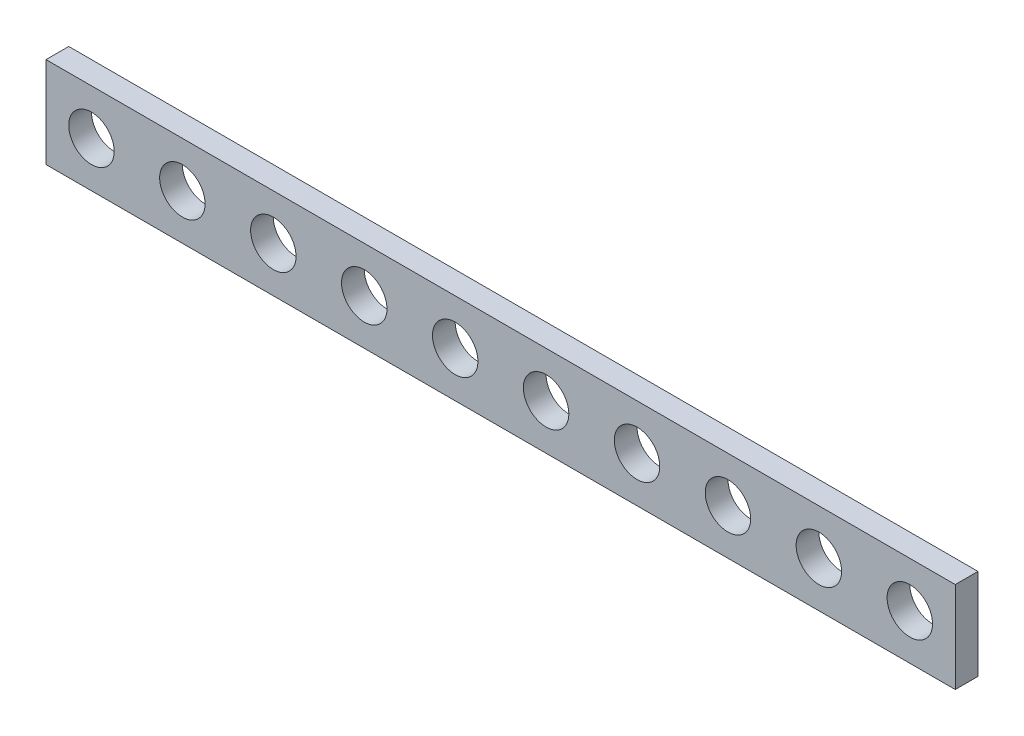
ISO-10303-21;
HEADER;
FILE_DESCRIPTION(('STEP AP214'),'2;1');
FILE_NAME('part.step','',(''),(''),'','','');
FILE_SCHEMA(('AUTOMOTIVE_DESIGN { 1 0 10303 214 1 1 1 1 }'));
ENDSEC;
DATA;
#1=APPLICATION_CONTEXT('core data for automotive mechanical design processes');
#2=APPLICATION_PROTOCOL_DEFINITION('international standard','automotive_design',2000,#1);
#3=PRODUCT_CONTEXT('',#1,'mechanical');
#4=PRODUCT('Part','Part','',(#3));
#5=PRODUCT_RELATED_PRODUCT_CATEGORY('part','',(#4));
#6=PRODUCT_DEFINITION_FORMATION('','',#4);
#7=PRODUCT_DEFINITION_CONTEXT('part definition',#1,'design');
#8=PRODUCT_DEFINITION('design','',#6,#7);
#9=PRODUCT_DEFINITION_SHAPE('','',#8);
#10=(LENGTH_UNIT() NAMED_UNIT(*) SI_UNIT(.MILLI.,.METRE.));
#11=(NAMED_UNIT(*) PLANE_ANGLE_UNIT() SI_UNIT($,.RADIAN.));
#12=(NAMED_UNIT(*) SI_UNIT($,.STERADIAN.) SOLID_ANGLE_UNIT());
#13=UNCERTAINTY_MEASURE_WITH_UNIT(LENGTH_MEASURE(1.E-05),#10,'distance_accuracy_value','');
#14=(GEOMETRIC_REPRESENTATION_CONTEXT(3) GLOBAL_UNCERTAINTY_ASSIGNED_CONTEXT((#13)) GLOBAL_UNIT_ASSIGNED_CONTEXT((#10,
#11,#12)) REPRESENTATION_CONTEXT('',''));
#15=CARTESIAN_POINT('',(0.,0.,0.));
#16=DIRECTION('',(0.,0.,1.));
#17=DIRECTION('',(1.,0.,0.));
#18=AXIS2_PLACEMENT_3D('',#15,#16,#17);
#19=CARTESIAN_POINT('',(190.,10.,5.));
#20=DIRECTION('',(0.,0.,-1.));
#21=DIRECTION('',(-1.,0.,0.));
#22=AXIS2_PLACEMENT_3D('',#19,#20,#21);
#23=CYLINDRICAL_SURFACE('',#22,5.);
#24=CARTESIAN_POINT('',(190.,10.,5.));
#25=DIRECTION('',(0.,0.,1.));
#26=DIRECTION('',(1.,0.,0.));
#27=AXIS2_PLACEMENT_3D('',#24,#25,#26);
#28=CIRCLE('',#27,5.);
#29=CARTESIAN_POINT('',(195.,10.,5.));
#30=VERTEX_POINT('',#29);
#31=EDGE_CURVE('E43',#30,#30,#28,.T.);
#32=ORIENTED_EDGE('',*,*,#31,.T.);
#33=EDGE_LOOP('',(#32));
#34=FACE_BOUND('',#33,.T.);
#35=CARTESIAN_POINT('',(190.,10.,0.));
#36=DIRECTION('',(0.,0.,1.));
#37=DIRECTION('',(1.,0.,0.));
#38=AXIS2_PLACEMENT_3D('',#35,#36,#37);
#39=CIRCLE('',#38,5.);
#40=CARTESIAN_POINT('',(195.,10.,0.));
#41=VERTEX_POINT('',#40);
#42=EDGE_CURVE('E11',#41,#41,#39,.T.);
#43=ORIENTED_EDGE('',*,*,#42,.F.);
#44=EDGE_LOOP('',(#43));
#45=FACE_BOUND('',#44,.T.);
#46=ADVANCED_FACE('F35',(#34,#45),#23,.F.);
#47=CARTESIAN_POINT('',(170.,10.,5.));
#48=DIRECTION('',(0.,0.,-1.));
#49=DIRECTION('',(-1.,0.,0.));
#50=AXIS2_PLACEMENT_3D('',#47,#48,#49);
#51=CYLINDRICAL_SURFACE('',#50,5.);
#52=CARTESIAN_POINT('',(170.,10.,5.));
#53=DIRECTION('',(0.,0.,1.));
#54=DIRECTION('',(1.,0.,0.));
#55=AXIS2_PLACEMENT_3D('',#52,#53,#54);
#56=CIRCLE('',#55,5.);
#57=CARTESIAN_POINT('',(175.,10.,5.));
#58=VERTEX_POINT('',#57);
#59=EDGE_CURVE('E155',#58,#58,#56,.T.);
#60=ORIENTED_EDGE('',*,*,#59,.T.);
#61=EDGE_LOOP('',(#60));
#62=FACE_BOUND('',#61,.T.);
#63=CARTESIAN_POINT('',(170.,10.,0.));
#64=DIRECTION('',(0.,0.,1.));
#65=DIRECTION('',(1.,0.,0.));
#66=AXIS2_PLACEMENT_3D('',#63,#64,#65);
#67=CIRCLE('',#66,5.);
#68=CARTESIAN_POINT('',(175.,10.,0.));
#69=VERTEX_POINT('',#68);
#70=EDGE_CURVE('E158',#69,#69,#67,.T.);
#71=ORIENTED_EDGE('',*,*,#70,.F.);
#72=EDGE_LOOP('',(#71));
#73=FACE_BOUND('',#72,.T.);
#74=ADVANCED_FACE('F217',(#62,#73),#51,.F.);
#75=CARTESIAN_POINT('',(150.,10.,5.));
#76=DIRECTION('',(0.,0.,-1.));
#77=DIRECTION('',(-1.,0.,0.));
#78=AXIS2_PLACEMENT_3D('',#75,#76,#77);
#79=CYLINDRICAL_SURFACE('',#78,5.);
#80=CARTESIAN_POINT('',(150.,10.,5.));
#81=DIRECTION('',(0.,0.,1.));
#82=DIRECTION('',(1.,0.,0.));
#83=AXIS2_PLACEMENT_3D('',#80,#81,#82);
#84=CIRCLE('',#83,5.);
#85=CARTESIAN_POINT('',(155.,10.,5.));
#86=VERTEX_POINT('',#85);
#87=EDGE_CURVE('E149',#86,#86,#84,.T.);
#88=ORIENTED_EDGE('',*,*,#87,.T.);
#89=EDGE_LOOP('',(#88));
#90=FACE_BOUND('',#89,.T.);
#91=CARTESIAN_POINT('',(150.,10.,0.));
#92=DIRECTION('',(0.,0.,1.));
#93=DIRECTION('',(1.,0.,0.));
#94=AXIS2_PLACEMENT_3D('',#91,#92,#93);
#95=CIRCLE('',#94,5.);
#96=CARTESIAN_POINT('',(155.,10.,0.));
#97=VERTEX_POINT('',#96);
#98=EDGE_CURVE('E152',#97,#97,#95,.T.);
#99=ORIENTED_EDGE('',*,*,#98,.F.);
#100=EDGE_LOOP('',(#99));
#101=FACE_BOUND('',#100,.T.);
#102=ADVANCED_FACE('F221',(#90,#101),#79,.F.);
#103=CARTESIAN_POINT('',(130.,10.,5.));
#104=DIRECTION('',(0.,0.,-1.));
#105=DIRECTION('',(-1.,0.,0.));
#106=AXIS2_PLACEMENT_3D('',#103,#104,#105);
#107=CYLINDRICAL_SURFACE('',#106,5.);
#108=CARTESIAN_POINT('',(130.,10.,5.));
#109=DIRECTION('',(0.,0.,1.));
#110=DIRECTION('',(1.,0.,0.));
#111=AXIS2_PLACEMENT_3D('',#108,#109,#110);
#112=CIRCLE('',#111,5.);
#113=CARTESIAN_POINT('',(135.,10.,5.));
#114=VERTEX_POINT('',#113);
#115=EDGE_CURVE('E143',#114,#114,#112,.T.);
#116=ORIENTED_EDGE('',*,*,#115,.T.);
#117=EDGE_LOOP('',(#116));
#118=FACE_BOUND('',#117,.T.);
#119=CARTESIAN_POINT('',(130.,10.,0.));
#120=DIRECTION('',(0.,0.,1.));
#121=DIRECTION('',(1.,0.,0.));
#122=AXIS2_PLACEMENT_3D('',#119,#120,#121);
#123=CIRCLE('',#122,5.);
#124=CARTESIAN_POINT('',(135.,10.,0.));
#125=VERTEX_POINT('',#124);
#126=EDGE_CURVE('E146',#125,#125,#123,.T.);
#127=ORIENTED_EDGE('',*,*,#126,.F.);
#128=EDGE_LOOP('',(#127));
#129=FACE_BOUND('',#128,.T.);
#130=ADVANCED_FACE('F226',(#118,#129),#107,.F.);
#131=CARTESIAN_POINT('',(110.,10.,5.));
#132=DIRECTION('',(0.,0.,-1.));
#133=DIRECTION('',(-1.,0.,0.));
#134=AXIS2_PLACEMENT_3D('',#131,#132,#133);
#135=CYLINDRICAL_SURFACE('',#134,5.);
#136=CARTESIAN_POINT('',(110.,10.,5.));
#137=DIRECTION('',(0.,0.,1.));
#138=DIRECTION('',(1.,0.,0.));
#139=AXIS2_PLACEMENT_3D('',#136,#137,#138);
#140=CIRCLE('',#139,5.);
#141=CARTESIAN_POINT('',(115.,10.,5.));
#142=VERTEX_POINT('',#141);
#143=EDGE_CURVE('E137',#142,#142,#140,.T.);
#144=ORIENTED_EDGE('',*,*,#143,.T.);
#145=EDGE_LOOP('',(#144));
#146=FACE_BOUND('',#145,.T.);
#147=CARTESIAN_POINT('',(110.,10.,0.));
#148=DIRECTION('',(0.,0.,1.));
#149=DIRECTION('',(1.,0.,0.));
#150=AXIS2_PLACEMENT_3D('',#147,#148,#149);
#151=CIRCLE('',#150,5.);
#152=CARTESIAN_POINT('',(115.,10.,0.));
#153=VERTEX_POINT('',#152);
#154=EDGE_CURVE('E140',#153,#153,#151,.T.);
#155=ORIENTED_EDGE('',*,*,#154,.F.);
#156=EDGE_LOOP('',(#155));
#157=FACE_BOUND('',#156,.T.);
#158=ADVANCED_FACE('F233',(#146,#157),#135,.F.);
#159=CARTESIAN_POINT('',(90.,10.,5.));
#160=DIRECTION('',(0.,0.,-1.));
#161=DIRECTION('',(-1.,0.,0.));
#162=AXIS2_PLACEMENT_3D('',#159,#160,#161);
#163=CYLINDRICAL_SURFACE('',#162,5.);
#164=CARTESIAN_POINT('',(90.,10.,5.));
#165=DIRECTION('',(0.,0.,1.));
#166=DIRECTION('',(1.,0.,0.));
#167=AXIS2_PLACEMENT_3D('',#164,#165,#166);
#168=CIRCLE('',#167,5.);
#169=CARTESIAN_POINT('',(95.,10.,5.));
#170=VERTEX_POINT('',#169);
#171=EDGE_CURVE('E131',#170,#170,#168,.T.);
#172=ORIENTED_EDGE('',*,*,#171,.T.);
#173=EDGE_LOOP('',(#172));
#174=FACE_BOUND('',#173,.T.);
#175=CARTESIAN_POINT('',(90.,10.,0.));
#176=DIRECTION('',(0.,0.,1.));
#177=DIRECTION('',(1.,0.,0.));
#178=AXIS2_PLACEMENT_3D('',#175,#176,#177);
#179=CIRCLE('',#178,5.);
#180=CARTESIAN_POINT('',(95.,10.,0.));
#181=VERTEX_POINT('',#180);
#182=EDGE_CURVE('E134',#181,#181,#179,.T.);
#183=ORIENTED_EDGE('',*,*,#182,.F.);
#184=EDGE_LOOP('',(#183));
#185=FACE_BOUND('',#184,.T.);
#186=ADVANCED_FACE('F237',(#174,#185),#163,.F.);
#187=CARTESIAN_POINT('',(70.,10.,5.));
#188=DIRECTION('',(0.,0.,-1.));
#189=DIRECTION('',(-1.,0.,0.));
#190=AXIS2_PLACEMENT_3D('',#187,#188,#189);
#191=CYLINDRICAL_SURFACE('',#190,5.);
#192=CARTESIAN_POINT('',(70.,10.,5.));
#193=DIRECTION('',(0.,0.,1.));
#194=DIRECTION('',(1.,0.,0.));
#195=AXIS2_PLACEMENT_3D('',#192,#193,#194);
#196=CIRCLE('',#195,5.);
#197=CARTESIAN_POINT('',(75.,10.,5.));
#198=VERTEX_POINT('',#197);
#199=EDGE_CURVE('E125',#198,#198,#196,.T.);
#200=ORIENTED_EDGE('',*,*,#199,.T.);
#201=EDGE_LOOP('',(#200));
#202=FACE_BOUND('',#201,.T.);
#203=CARTESIAN_POINT('',(70.,10.,0.));
#204=DIRECTION('',(0.,0.,1.));
#205=DIRECTION('',(1.,0.,0.));
#206=AXIS2_PLACEMENT_3D('',#203,#204,#205);
#207=CIRCLE('',#206,5.);
#208=CARTESIAN_POINT('',(75.,10.,0.));
#209=VERTEX_POINT('',#208);
#210=EDGE_CURVE('E128',#209,#209,#207,.T.);
#211=ORIENTED_EDGE('',*,*,#210,.F.);
#212=EDGE_LOOP('',(#211));
#213=FACE_BOUND('',#212,.T.);
#214=ADVANCED_FACE('F241',(#202,#213),#191,.F.);
#215=CARTESIAN_POINT('',(50.,10.,5.));
#216=DIRECTION('',(0.,0.,-1.));
#217=DIRECTION('',(-1.,0.,0.));
#218=AXIS2_PLACEMENT_3D('',#215,#216,#217);
#219=CYLINDRICAL_SURFACE('',#218,5.);
#220=CARTESIAN_POINT('',(50.,10.,5.));
#221=DIRECTION('',(0.,0.,1.));
#222=DIRECTION('',(1.,0.,0.));
#223=AXIS2_PLACEMENT_3D('',#220,#221,#222);
#224=CIRCLE('',#223,5.);
#225=CARTESIAN_POINT('',(55.,10.,5.));
#226=VERTEX_POINT('',#225);
#227=EDGE_CURVE('E119',#226,#226,#224,.T.);
#228=ORIENTED_EDGE('',*,*,#227,.T.);
#229=EDGE_LOOP('',(#228));
#230=FACE_BOUND('',#229,.T.);
#231=CARTESIAN_POINT('',(50.,10.,0.));
#232=DIRECTION('',(0.,0.,1.));
#233=DIRECTION('',(1.,0.,0.));
#234=AXIS2_PLACEMENT_3D('',#231,#232,#233);
#235=CIRCLE('',#234,5.);
#236=CARTESIAN_POINT('',(55.,10.,0.));
#237=VERTEX_POINT('',#236);
#238=EDGE_CURVE('E122',#237,#237,#235,.T.);
#239=ORIENTED_EDGE('',*,*,#238,.F.);
#240=EDGE_LOOP('',(#239));
#241=FACE_BOUND('',#240,.T.);
#242=ADVANCED_FACE('F188',(#230,#241),#219,.F.);
#243=CARTESIAN_POINT('',(30.,10.,5.));
#244=DIRECTION('',(0.,0.,-1.));
#245=DIRECTION('',(-1.,0.,0.));
#246=AXIS2_PLACEMENT_3D('',#243,#244,#245);
#247=CYLINDRICAL_SURFACE('',#246,5.);
#248=CARTESIAN_POINT('',(30.,10.,5.));
#249=DIRECTION('',(0.,0.,1.));
#250=DIRECTION('',(1.,0.,0.));
#251=AXIS2_PLACEMENT_3D('',#248,#249,#250);
#252=CIRCLE('',#251,5.);
#253=CARTESIAN_POINT('',(35.,10.,5.));
#254=VERTEX_POINT('',#253);
#255=EDGE_CURVE('E113',#254,#254,#252,.T.);
#256=ORIENTED_EDGE('',*,*,#255,.T.);
#257=EDGE_LOOP('',(#256));
#258=FACE_BOUND('',#257,.T.);
#259=CARTESIAN_POINT('',(30.,10.,0.));
#260=DIRECTION('',(0.,0.,1.));
#261=DIRECTION('',(1.,0.,0.));
#262=AXIS2_PLACEMENT_3D('',#259,#260,#261);
#263=CIRCLE('',#262,5.);
#264=CARTESIAN_POINT('',(35.,10.,0.));
#265=VERTEX_POINT('',#264);
#266=EDGE_CURVE('E116',#265,#265,#263,.T.);
#267=ORIENTED_EDGE('',*,*,#266,.F.);
#268=EDGE_LOOP('',(#267));
#269=FACE_BOUND('',#268,.T.);
#270=ADVANCED_FACE('F168',(#258,#269),#247,.F.);
#271=CARTESIAN_POINT('',(0.,0.,5.));
#272=DIRECTION('',(0.,0.,-1.));
#273=DIRECTION('',(-1.,0.,0.));
#274=AXIS2_PLACEMENT_3D('',#271,#272,#273);
#275=PLANE('',#274);
#276=ORIENTED_EDGE('',*,*,#31,.F.);
#277=EDGE_LOOP('',(#276));
#278=FACE_BOUND('',#277,.T.);
#279=ORIENTED_EDGE('',*,*,#59,.F.);
#280=EDGE_LOOP('',(#279));
#281=FACE_BOUND('',#280,.T.);
#282=ORIENTED_EDGE('',*,*,#87,.F.);
#283=EDGE_LOOP('',(#282));
#284=FACE_BOUND('',#283,.T.);
#285=ORIENTED_EDGE('',*,*,#115,.F.);
#286=EDGE_LOOP('',(#285));
#287=FACE_BOUND('',#286,.T.);
#288=ORIENTED_EDGE('',*,*,#143,.F.);
#289=EDGE_LOOP('',(#288));
#290=FACE_BOUND('',#289,.T.);
#291=ORIENTED_EDGE('',*,*,#171,.F.);
#292=EDGE_LOOP('',(#291));
#293=FACE_BOUND('',#292,.T.);
#294=ORIENTED_EDGE('',*,*,#199,.F.);
#295=EDGE_LOOP('',(#294));
#296=FACE_BOUND('',#295,.T.);
#297=ORIENTED_EDGE('',*,*,#227,.F.);
#298=EDGE_LOOP('',(#297));
#299=FACE_BOUND('',#298,.T.);
#300=ORIENTED_EDGE('',*,*,#255,.F.);
#301=EDGE_LOOP('',(#300));
#302=FACE_BOUND('',#301,.T.);
#303=DIRECTION('',(0.,-1.,0.));
#304=VECTOR('',#303,1.);
#305=CARTESIAN_POINT('',(0.,0.,5.));
#306=LINE('',#305,#304);
#307=CARTESIAN_POINT('',(0.,20.,5.));
#308=VERTEX_POINT('',#307);
#309=CARTESIAN_POINT('',(0.,0.,5.));
#310=VERTEX_POINT('',#309);
#311=EDGE_CURVE('E88',#308,#310,#306,.T.);
#312=ORIENTED_EDGE('',*,*,#311,.T.);
#313=DIRECTION('',(1.,0.,0.));
#314=VECTOR('',#313,1.);
#315=CARTESIAN_POINT('',(0.,0.,5.));
#316=LINE('',#315,#314);
#317=CARTESIAN_POINT('',(200.,0.,5.));
#318=VERTEX_POINT('',#317);
#319=EDGE_CURVE('E82',#310,#318,#316,.T.);
#320=ORIENTED_EDGE('',*,*,#319,.T.);
#321=DIRECTION('',(0.,1.,0.));
#322=VECTOR('',#321,1.);
#323=CARTESIAN_POINT('',(200.,20.,5.));
#324=LINE('',#323,#322);
#325=CARTESIAN_POINT('',(200.,20.,5.));
#326=VERTEX_POINT('',#325);
#327=EDGE_CURVE('E86',#318,#326,#324,.T.);
#328=ORIENTED_EDGE('',*,*,#327,.T.);
#329=DIRECTION('',(-1.,0.,0.));
#330=VECTOR('',#329,1.);
#331=CARTESIAN_POINT('',(0.,20.,5.));
#332=LINE('',#331,#330);
#333=EDGE_CURVE('E51',#326,#308,#332,.T.);
#334=ORIENTED_EDGE('',*,*,#333,.T.);
#335=EDGE_LOOP('',(#312,#320,#328,#334));
#336=FACE_BOUND('',#335,.T.);
#337=CARTESIAN_POINT('',(10.,10.,5.));
#338=DIRECTION('',(0.,0.,1.));
#339=DIRECTION('',(1.,0.,0.));
#340=AXIS2_PLACEMENT_3D('',#337,#338,#339);
#341=CIRCLE('',#340,5.);
#342=CARTESIAN_POINT('',(15.,10.,5.));
#343=VERTEX_POINT('',#342);
#344=EDGE_CURVE('E106',#343,#343,#341,.T.);
#345=ORIENTED_EDGE('',*,*,#344,.F.);
#346=EDGE_LOOP('',(#345));
#347=FACE_BOUND('',#346,.T.);
#348=ADVANCED_FACE('F83',(#278,#281,#284,#287,#290,#293,#296,#299,#302,#336,#347),#275,.F.);
#349=CARTESIAN_POINT('',(0.,0.,0.));
#350=DIRECTION('',(0.,0.,-1.));
#351=DIRECTION('',(-1.,0.,0.));
#352=AXIS2_PLACEMENT_3D('',#349,#350,#351);
#353=PLANE('',#352);
#354=ORIENTED_EDGE('',*,*,#42,.T.);
#355=EDGE_LOOP('',(#354));
#356=FACE_BOUND('',#355,.T.);
#357=ORIENTED_EDGE('',*,*,#70,.T.);
#358=EDGE_LOOP('',(#357));
#359=FACE_BOUND('',#358,.T.);
#360=ORIENTED_EDGE('',*,*,#98,.T.);
#361=EDGE_LOOP('',(#360));
#362=FACE_BOUND('',#361,.T.);
#363=ORIENTED_EDGE('',*,*,#126,.T.);
#364=EDGE_LOOP('',(#363));
#365=FACE_BOUND('',#364,.T.);
#366=ORIENTED_EDGE('',*,*,#154,.T.);
#367=EDGE_LOOP('',(#366));
#368=FACE_BOUND('',#367,.T.);
#369=ORIENTED_EDGE('',*,*,#182,.T.);
#370=EDGE_LOOP('',(#369));
#371=FACE_BOUND('',#370,.T.);
#372=ORIENTED_EDGE('',*,*,#210,.T.);
#373=EDGE_LOOP('',(#372));
#374=FACE_BOUND('',#373,.T.);
#375=ORIENTED_EDGE('',*,*,#238,.T.);
#376=EDGE_LOOP('',(#375));
#377=FACE_BOUND('',#376,.T.);
#378=ORIENTED_EDGE('',*,*,#266,.T.);
#379=EDGE_LOOP('',(#378));
#380=FACE_BOUND('',#379,.T.);
#381=DIRECTION('',(0.,-1.,0.));
#382=VECTOR('',#381,1.);
#383=CARTESIAN_POINT('',(0.,0.,0.));
#384=LINE('',#383,#382);
#385=CARTESIAN_POINT('',(0.,20.,0.));
#386=VERTEX_POINT('',#385);
#387=CARTESIAN_POINT('',(0.,0.,0.));
#388=VERTEX_POINT('',#387);
#389=EDGE_CURVE('E103',#386,#388,#384,.T.);
#390=ORIENTED_EDGE('',*,*,#389,.F.);
#391=DIRECTION('',(-1.,0.,0.));
#392=VECTOR('',#391,1.);
#393=CARTESIAN_POINT('',(0.,20.,0.));
#394=LINE('',#393,#392);
#395=CARTESIAN_POINT('',(200.,20.,0.));
#396=VERTEX_POINT('',#395);
#397=EDGE_CURVE('E74',#396,#386,#394,.T.);
#398=ORIENTED_EDGE('',*,*,#397,.F.);
#399=DIRECTION('',(0.,1.,0.));
#400=VECTOR('',#399,1.);
#401=CARTESIAN_POINT('',(200.,20.,0.));
#402=LINE('',#401,#400);
#403=CARTESIAN_POINT('',(200.,0.,0.));
#404=VERTEX_POINT('',#403);
#405=EDGE_CURVE('E68',#404,#396,#402,.T.);
#406=ORIENTED_EDGE('',*,*,#405,.F.);
#407=DIRECTION('',(1.,0.,0.));
#408=VECTOR('',#407,1.);
#409=CARTESIAN_POINT('',(0.,0.,0.));
#410=LINE('',#409,#408);
#411=EDGE_CURVE('E93',#388,#404,#410,.T.);
#412=ORIENTED_EDGE('',*,*,#411,.F.);
#413=EDGE_LOOP('',(#390,#398,#406,#412));
#414=FACE_BOUND('',#413,.T.);
#415=CARTESIAN_POINT('',(10.,10.,0.));
#416=DIRECTION('',(0.,0.,1.));
#417=DIRECTION('',(1.,0.,0.));
#418=AXIS2_PLACEMENT_3D('',#415,#416,#417);
#419=CIRCLE('',#418,5.);
#420=CARTESIAN_POINT('',(15.,10.,0.));
#421=VERTEX_POINT('',#420);
#422=EDGE_CURVE('E201',#421,#421,#419,.T.);
#423=ORIENTED_EDGE('',*,*,#422,.T.);
#424=EDGE_LOOP('',(#423));
#425=FACE_BOUND('',#424,.T.);
#426=ADVANCED_FACE('F167',(#356,#359,#362,#365,#368,#371,#374,#377,#380,#414,#425),#353,.T.);
#427=CARTESIAN_POINT('',(0.,0.,5.));
#428=DIRECTION('',(1.,0.,0.));
#429=DIRECTION('',(0.,0.,-1.));
#430=AXIS2_PLACEMENT_3D('',#427,#428,#429);
#431=PLANE('',#430);
#432=ORIENTED_EDGE('',*,*,#389,.T.);
#433=DIRECTION('',(0.,0.,-1.));
#434=VECTOR('',#433,1.);
#435=CARTESIAN_POINT('',(0.,0.,5.));
#436=LINE('',#435,#434);
#437=EDGE_CURVE('E94',#310,#388,#436,.T.);
#438=ORIENTED_EDGE('',*,*,#437,.F.);
#439=ORIENTED_EDGE('',*,*,#311,.F.);
#440=DIRECTION('',(0.,0.,-1.));
#441=VECTOR('',#440,1.);
#442=CARTESIAN_POINT('',(0.,20.,5.));
#443=LINE('',#442,#441);
#444=EDGE_CURVE('E99',#308,#386,#443,.T.);
#445=ORIENTED_EDGE('',*,*,#444,.T.);
#446=EDGE_LOOP('',(#432,#438,#439,#445));
#447=FACE_BOUND('',#446,.T.);
#448=ADVANCED_FACE('F194',(#447),#431,.F.);
#449=CARTESIAN_POINT('',(0.,0.,5.));
#450=DIRECTION('',(0.,1.,0.));
#451=DIRECTION('',(0.,0.,1.));
#452=AXIS2_PLACEMENT_3D('',#449,#450,#451);
#453=PLANE('',#452);
#454=ORIENTED_EDGE('',*,*,#411,.T.);
#455=DIRECTION('',(0.,0.,-1.));
#456=VECTOR('',#455,1.);
#457=CARTESIAN_POINT('',(200.,0.,5.));
#458=LINE('',#457,#456);
#459=EDGE_CURVE('E91',#318,#404,#458,.T.);
#460=ORIENTED_EDGE('',*,*,#459,.F.);
#461=ORIENTED_EDGE('',*,*,#319,.F.);
#462=ORIENTED_EDGE('',*,*,#437,.T.);
#463=EDGE_LOOP('',(#454,#460,#461,#462));
#464=FACE_BOUND('',#463,.T.);
#465=ADVANCED_FACE('F92',(#464),#453,.F.);
#466=CARTESIAN_POINT('',(200.,20.,5.));
#467=DIRECTION('',(-1.,0.,0.));
#468=DIRECTION('',(0.,0.,1.));
#469=AXIS2_PLACEMENT_3D('',#466,#467,#468);
#470=PLANE('',#469);
#471=ORIENTED_EDGE('',*,*,#405,.T.);
#472=DIRECTION('',(0.,0.,-1.));
#473=VECTOR('',#472,1.);
#474=CARTESIAN_POINT('',(200.,20.,5.));
#475=LINE('',#474,#473);
#476=EDGE_CURVE('E95',#326,#396,#475,.T.);
#477=ORIENTED_EDGE('',*,*,#476,.F.);
#478=ORIENTED_EDGE('',*,*,#327,.F.);
#479=ORIENTED_EDGE('',*,*,#459,.T.);
#480=EDGE_LOOP('',(#471,#477,#478,#479));
#481=FACE_BOUND('',#480,.T.);
#482=ADVANCED_FACE('F97',(#481),#470,.F.);
#483=CARTESIAN_POINT('',(0.,20.,5.));
#484=DIRECTION('',(0.,-1.,0.));
#485=DIRECTION('',(1.,0.,0.));
#486=AXIS2_PLACEMENT_3D('',#483,#484,#485);
#487=PLANE('',#486);
#488=ORIENTED_EDGE('',*,*,#397,.T.);
#489=ORIENTED_EDGE('',*,*,#444,.F.);
#490=ORIENTED_EDGE('',*,*,#333,.F.);
#491=ORIENTED_EDGE('',*,*,#476,.T.);
#492=EDGE_LOOP('',(#488,#489,#490,#491));
#493=FACE_BOUND('',#492,.T.);
#494=ADVANCED_FACE('F210',(#493),#487,.F.);
#495=CARTESIAN_POINT('',(10.,10.,5.));
#496=DIRECTION('',(0.,0.,-1.));
#497=DIRECTION('',(-1.,0.,0.));
#498=AXIS2_PLACEMENT_3D('',#495,#496,#497);
#499=CYLINDRICAL_SURFACE('',#498,5.);
#500=ORIENTED_EDGE('',*,*,#344,.T.);
#501=EDGE_LOOP('',(#500));
#502=FACE_BOUND('',#501,.T.);
#503=ORIENTED_EDGE('',*,*,#422,.F.);
#504=EDGE_LOOP('',(#503));
#505=FACE_BOUND('',#504,.T.);
#506=ADVANCED_FACE('F208',(#502,#505),#499,.F.);
#507=CLOSED_SHELL('',(#46,#74,#102,#130,#158,#186,#214,#242,#270,#348,#426,#448,#465,#482,#494,#506));
#508=MANIFOLD_SOLID_BREP('B2',#507);
#509=ADVANCED_BREP_SHAPE_REPRESENTATION('',(#18,#508),#14);
#510=SHAPE_DEFINITION_REPRESENTATION(#9,#509);
ENDSEC;
END-ISO-10303-21;
